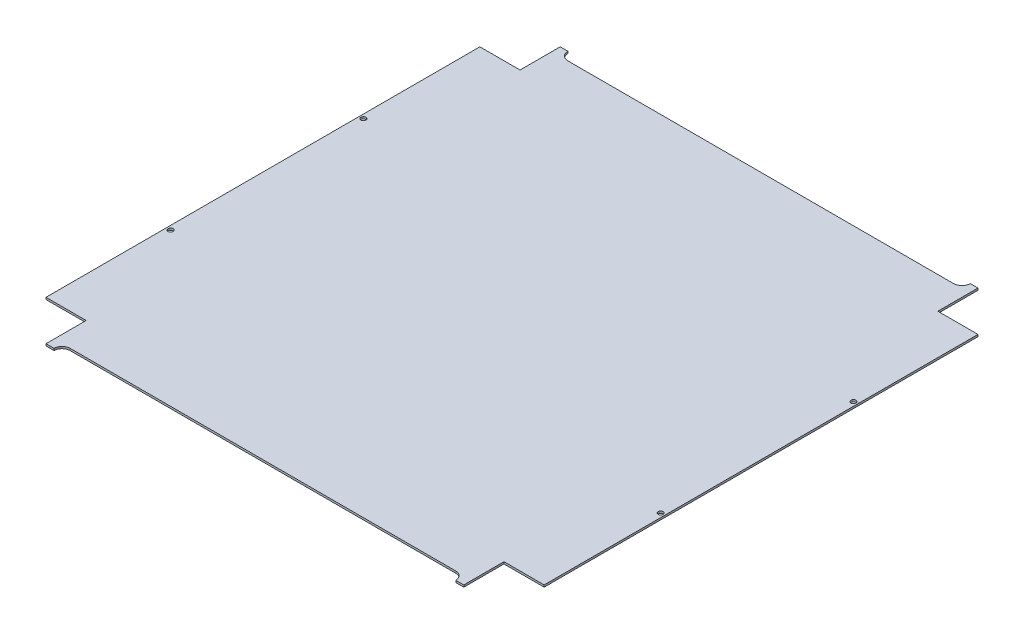
ISO-10303-21;
HEADER;
FILE_DESCRIPTION(('STEP AP214'),'2;1');
FILE_NAME('part.step','',(''),(''),'','','');
FILE_SCHEMA(('AUTOMOTIVE_DESIGN { 1 0 10303 214 1 1 1 1 }'));
ENDSEC;
DATA;
#1=APPLICATION_CONTEXT('core data for automotive mechanical design processes');
#2=APPLICATION_PROTOCOL_DEFINITION('international standard','automotive_design',2000,#1);
#3=PRODUCT_CONTEXT('',#1,'mechanical');
#4=PRODUCT('Part','Part','',(#3));
#5=PRODUCT_RELATED_PRODUCT_CATEGORY('part','',(#4));
#6=PRODUCT_DEFINITION_FORMATION('','',#4);
#7=PRODUCT_DEFINITION_CONTEXT('part definition',#1,'design');
#8=PRODUCT_DEFINITION('design','',#6,#7);
#9=PRODUCT_DEFINITION_SHAPE('','',#8);
#10=(LENGTH_UNIT() NAMED_UNIT(*) SI_UNIT(.MILLI.,.METRE.));
#11=(NAMED_UNIT(*) PLANE_ANGLE_UNIT() SI_UNIT($,.RADIAN.));
#12=(NAMED_UNIT(*) SI_UNIT($,.STERADIAN.) SOLID_ANGLE_UNIT());
#13=UNCERTAINTY_MEASURE_WITH_UNIT(LENGTH_MEASURE(1.E-05),#10,'distance_accuracy_value','');
#14=(GEOMETRIC_REPRESENTATION_CONTEXT(3) GLOBAL_UNCERTAINTY_ASSIGNED_CONTEXT((#13)) GLOBAL_UNIT_ASSIGNED_CONTEXT((#10,
#11,#12)) REPRESENTATION_CONTEXT('',''));
#15=CARTESIAN_POINT('',(0.,0.,0.));
#16=DIRECTION('',(0.,0.,1.));
#17=DIRECTION('',(1.,0.,0.));
#18=AXIS2_PLACEMENT_3D('',#15,#16,#17);
#19=CARTESIAN_POINT('',(150.65127350678,1.5875,-205.005137025259));
#20=DIRECTION('',(0.,-1.,0.));
#21=DIRECTION('',(0.,0.,-1.));
#22=AXIS2_PLACEMENT_3D('',#19,#20,#21);
#23=CYLINDRICAL_SURFACE('',#22,6.60722606806879);
#24=CARTESIAN_POINT('',(150.65127350678,0.,-205.005137025259));
#25=DIRECTION('',(0.,1.,0.));
#26=DIRECTION('',(0.,0.,1.));
#27=AXIS2_PLACEMENT_3D('',#24,#25,#26);
#28=CIRCLE('',#27,6.60722606806879);
#29=CARTESIAN_POINT('',(150.65127350678,0.,-198.39791095719));
#30=VERTEX_POINT('',#29);
#31=CARTESIAN_POINT('',(157.258499574849,0.,-205.005137025259));
#32=VERTEX_POINT('',#31);
#33=EDGE_CURVE('E205',#30,#32,#28,.T.);
#34=ORIENTED_EDGE('',*,*,#33,.F.);
#35=DIRECTION('',(0.,-1.,0.));
#36=VECTOR('',#35,1.);
#37=CARTESIAN_POINT('',(150.65127350678,1.5875,-198.39791095719));
#38=LINE('',#37,#36);
#39=CARTESIAN_POINT('',(150.65127350678,1.5875,-198.39791095719));
#40=VERTEX_POINT('',#39);
#41=EDGE_CURVE('E11',#40,#30,#38,.T.);
#42=ORIENTED_EDGE('',*,*,#41,.F.);
#43=CARTESIAN_POINT('',(150.65127350678,1.5875,-205.005137025259));
#44=DIRECTION('',(0.,1.,0.));
#45=DIRECTION('',(0.,0.,1.));
#46=AXIS2_PLACEMENT_3D('',#43,#44,#45);
#47=CIRCLE('',#46,6.60722606806879);
#48=CARTESIAN_POINT('',(157.258499574849,1.5875,-205.005137025259));
#49=VERTEX_POINT('',#48);
#50=EDGE_CURVE('E312',#40,#49,#47,.T.);
#51=ORIENTED_EDGE('',*,*,#50,.T.);
#52=DIRECTION('',(0.,-1.,0.));
#53=VECTOR('',#52,1.);
#54=CARTESIAN_POINT('',(157.258499574849,1.5875,-205.005137025259));
#55=LINE('',#54,#53);
#56=EDGE_CURVE('E55',#49,#32,#55,.T.);
#57=ORIENTED_EDGE('',*,*,#56,.T.);
#58=EDGE_LOOP('',(#34,#42,#51,#57));
#59=FACE_BOUND('',#58,.T.);
#60=ADVANCED_FACE('F39',(#59),#23,.F.);
#61=CARTESIAN_POINT('',(0.,1.5875,-198.39791095719));
#62=DIRECTION('',(0.,0.,-1.));
#63=DIRECTION('',(-1.,0.,0.));
#64=AXIS2_PLACEMENT_3D('',#61,#62,#63);
#65=PLANE('',#64);
#66=DIRECTION('',(1.,0.,0.));
#67=VECTOR('',#66,1.);
#68=CARTESIAN_POINT('',(0.,0.,-198.39791095719));
#69=LINE('',#68,#67);
#70=CARTESIAN_POINT('',(-154.14872649322,0.,-198.39791095719));
#71=VERTEX_POINT('',#70);
#72=EDGE_CURVE('E207',#71,#30,#69,.T.);
#73=ORIENTED_EDGE('',*,*,#72,.F.);
#74=DIRECTION('',(0.,-1.,0.));
#75=VECTOR('',#74,1.);
#76=CARTESIAN_POINT('',(-154.14872649322,1.5875,-198.39791095719));
#77=LINE('',#76,#75);
#78=CARTESIAN_POINT('',(-154.14872649322,1.5875,-198.39791095719));
#79=VERTEX_POINT('',#78);
#80=EDGE_CURVE('E47',#79,#71,#77,.T.);
#81=ORIENTED_EDGE('',*,*,#80,.F.);
#82=DIRECTION('',(1.,0.,0.));
#83=VECTOR('',#82,1.);
#84=CARTESIAN_POINT('',(0.,1.5875,-198.39791095719));
#85=LINE('',#84,#83);
#86=EDGE_CURVE('E309',#79,#40,#85,.T.);
#87=ORIENTED_EDGE('',*,*,#86,.T.);
#88=ORIENTED_EDGE('',*,*,#41,.T.);
#89=EDGE_LOOP('',(#73,#81,#87,#88));
#90=FACE_BOUND('',#89,.T.);
#91=ADVANCED_FACE('F299',(#90),#65,.T.);
#92=CARTESIAN_POINT('',(-154.14872649322,1.5875,-205.005137025259));
#93=DIRECTION('',(0.,-1.,0.));
#94=DIRECTION('',(0.,0.,-1.));
#95=AXIS2_PLACEMENT_3D('',#92,#93,#94);
#96=CYLINDRICAL_SURFACE('',#95,6.60722606806879);
#97=CARTESIAN_POINT('',(-154.14872649322,0.,-205.005137025259));
#98=DIRECTION('',(0.,1.,0.));
#99=DIRECTION('',(0.,0.,1.));
#100=AXIS2_PLACEMENT_3D('',#97,#98,#99);
#101=CIRCLE('',#100,6.60722606806879);
#102=CARTESIAN_POINT('',(-160.755952561289,0.,-205.005137025259));
#103=VERTEX_POINT('',#102);
#104=EDGE_CURVE('E211',#103,#71,#101,.T.);
#105=ORIENTED_EDGE('',*,*,#104,.F.);
#106=DIRECTION('',(0.,-1.,0.));
#107=VECTOR('',#106,1.);
#108=CARTESIAN_POINT('',(-160.755952561289,1.5875,-205.005137025259));
#109=LINE('',#108,#107);
#110=CARTESIAN_POINT('',(-160.755952561289,1.5875,-205.005137025259));
#111=VERTEX_POINT('',#110);
#112=EDGE_CURVE('E288',#111,#103,#109,.T.);
#113=ORIENTED_EDGE('',*,*,#112,.F.);
#114=CARTESIAN_POINT('',(-154.14872649322,1.5875,-205.005137025259));
#115=DIRECTION('',(0.,1.,0.));
#116=DIRECTION('',(0.,0.,1.));
#117=AXIS2_PLACEMENT_3D('',#114,#115,#116);
#118=CIRCLE('',#117,6.60722606806879);
#119=EDGE_CURVE('E295',#111,#79,#118,.T.);
#120=ORIENTED_EDGE('',*,*,#119,.T.);
#121=ORIENTED_EDGE('',*,*,#80,.T.);
#122=EDGE_LOOP('',(#105,#113,#120,#121));
#123=FACE_BOUND('',#122,.T.);
#124=ADVANCED_FACE('F293',(#123),#96,.F.);
#125=CARTESIAN_POINT('',(0.,1.5875,-205.005137025259));
#126=DIRECTION('',(0.,0.,-1.));
#127=DIRECTION('',(-1.,0.,0.));
#128=AXIS2_PLACEMENT_3D('',#125,#126,#127);
#129=PLANE('',#128);
#130=DIRECTION('',(1.,0.,0.));
#131=VECTOR('',#130,1.);
#132=CARTESIAN_POINT('',(0.,0.,-205.005137025259));
#133=LINE('',#132,#131);
#134=CARTESIAN_POINT('',(-166.84872649322,0.,-205.005137025259));
#135=VERTEX_POINT('',#134);
#136=EDGE_CURVE('E214',#135,#103,#133,.T.);
#137=ORIENTED_EDGE('',*,*,#136,.F.);
#138=DIRECTION('',(0.,-1.,0.));
#139=VECTOR('',#138,1.);
#140=CARTESIAN_POINT('',(-166.84872649322,1.5875,-205.005137025259));
#141=LINE('',#140,#139);
#142=CARTESIAN_POINT('',(-166.84872649322,1.5875,-205.005137025259));
#143=VERTEX_POINT('',#142);
#144=EDGE_CURVE('E286',#143,#135,#141,.T.);
#145=ORIENTED_EDGE('',*,*,#144,.F.);
#146=DIRECTION('',(1.,0.,0.));
#147=VECTOR('',#146,1.);
#148=CARTESIAN_POINT('',(0.,1.5875,-205.005137025259));
#149=LINE('',#148,#147);
#150=EDGE_CURVE('E202',#143,#111,#149,.T.);
#151=ORIENTED_EDGE('',*,*,#150,.T.);
#152=ORIENTED_EDGE('',*,*,#112,.T.);
#153=EDGE_LOOP('',(#137,#145,#151,#152));
#154=FACE_BOUND('',#153,.T.);
#155=ADVANCED_FACE('F305',(#154),#129,.T.);
#156=CARTESIAN_POINT('',(-166.84872649322,1.5875,-2.91715429578202E-13));
#157=DIRECTION('',(1.,0.,0.));
#158=DIRECTION('',(0.,0.,-1.));
#159=AXIS2_PLACEMENT_3D('',#156,#157,#158);
#160=PLANE('',#159);
#161=DIRECTION('',(0.,0.,1.));
#162=VECTOR('',#161,1.);
#163=CARTESIAN_POINT('',(-166.84872649322,0.,-2.91715429578202E-13));
#164=LINE('',#163,#162);
#165=CARTESIAN_POINT('',(-166.84872649322,0.,-173.255137025259));
#166=VERTEX_POINT('',#165);
#167=EDGE_CURVE('E217',#135,#166,#164,.T.);
#168=ORIENTED_EDGE('',*,*,#167,.T.);
#169=DIRECTION('',(0.,-1.,0.));
#170=VECTOR('',#169,1.);
#171=CARTESIAN_POINT('',(-166.84872649322,1.5875,-173.255137025259));
#172=LINE('',#171,#170);
#173=CARTESIAN_POINT('',(-166.84872649322,1.5875,-173.255137025259));
#174=VERTEX_POINT('',#173);
#175=EDGE_CURVE('E284',#174,#166,#172,.T.);
#176=ORIENTED_EDGE('',*,*,#175,.F.);
#177=DIRECTION('',(0.,0.,1.));
#178=VECTOR('',#177,1.);
#179=CARTESIAN_POINT('',(-166.84872649322,1.5875,-2.91715429578202E-13));
#180=LINE('',#179,#178);
#181=EDGE_CURVE('E311',#143,#174,#180,.T.);
#182=ORIENTED_EDGE('',*,*,#181,.F.);
#183=ORIENTED_EDGE('',*,*,#144,.T.);
#184=EDGE_LOOP('',(#168,#176,#182,#183));
#185=FACE_BOUND('',#184,.T.);
#186=ADVANCED_FACE('F408',(#185),#160,.F.);
#187=CARTESIAN_POINT('',(0.,1.5875,-173.255137025259));
#188=DIRECTION('',(0.,0.,-1.));
#189=DIRECTION('',(-1.,0.,0.));
#190=AXIS2_PLACEMENT_3D('',#187,#188,#189);
#191=PLANE('',#190);
#192=DIRECTION('',(1.,0.,0.));
#193=VECTOR('',#192,1.);
#194=CARTESIAN_POINT('',(0.,0.,-173.255137025259));
#195=LINE('',#194,#193);
#196=CARTESIAN_POINT('',(-198.59872649322,0.,-173.255137025259));
#197=VERTEX_POINT('',#196);
#198=EDGE_CURVE('E221',#197,#166,#195,.T.);
#199=ORIENTED_EDGE('',*,*,#198,.F.);
#200=DIRECTION('',(0.,-1.,0.));
#201=VECTOR('',#200,1.);
#202=CARTESIAN_POINT('',(-198.59872649322,1.5875,-173.255137025259));
#203=LINE('',#202,#201);
#204=CARTESIAN_POINT('',(-198.59872649322,1.5875,-173.255137025259));
#205=VERTEX_POINT('',#204);
#206=EDGE_CURVE('E282',#205,#197,#203,.T.);
#207=ORIENTED_EDGE('',*,*,#206,.F.);
#208=DIRECTION('',(1.,0.,0.));
#209=VECTOR('',#208,1.);
#210=CARTESIAN_POINT('',(0.,1.5875,-173.255137025259));
#211=LINE('',#210,#209);
#212=EDGE_CURVE('E317',#205,#174,#211,.T.);
#213=ORIENTED_EDGE('',*,*,#212,.T.);
#214=ORIENTED_EDGE('',*,*,#175,.T.);
#215=EDGE_LOOP('',(#199,#207,#213,#214));
#216=FACE_BOUND('',#215,.T.);
#217=ADVANCED_FACE('F411',(#216),#191,.T.);
#218=CARTESIAN_POINT('',(-198.59872649322,1.5875,0.));
#219=DIRECTION('',(1.,0.,0.));
#220=DIRECTION('',(0.,0.,-1.));
#221=AXIS2_PLACEMENT_3D('',#218,#219,#220);
#222=PLANE('',#221);
#223=DIRECTION('',(0.,0.,1.));
#224=VECTOR('',#223,1.);
#225=CARTESIAN_POINT('',(-198.59872649322,0.,0.));
#226=LINE('',#225,#224);
#227=CARTESIAN_POINT('',(-198.59872649322,0.,169.644862974739));
#228=VERTEX_POINT('',#227);
#229=EDGE_CURVE('E224',#197,#228,#226,.T.);
#230=ORIENTED_EDGE('',*,*,#229,.T.);
#231=DIRECTION('',(0.,-1.,0.));
#232=VECTOR('',#231,1.);
#233=CARTESIAN_POINT('',(-198.59872649322,1.5875,169.644862974739));
#234=LINE('',#233,#232);
#235=CARTESIAN_POINT('',(-198.59872649322,1.5875,169.644862974739));
#236=VERTEX_POINT('',#235);
#237=EDGE_CURVE('E279',#236,#228,#234,.T.);
#238=ORIENTED_EDGE('',*,*,#237,.F.);
#239=DIRECTION('',(0.,0.,1.));
#240=VECTOR('',#239,1.);
#241=CARTESIAN_POINT('',(-198.59872649322,1.5875,0.));
#242=LINE('',#241,#240);
#243=EDGE_CURVE('E320',#205,#236,#242,.T.);
#244=ORIENTED_EDGE('',*,*,#243,.F.);
#245=ORIENTED_EDGE('',*,*,#206,.T.);
#246=EDGE_LOOP('',(#230,#238,#244,#245));
#247=FACE_BOUND('',#246,.T.);
#248=ADVANCED_FACE('F415',(#247),#222,.F.);
#249=CARTESIAN_POINT('',(1.48302073136957E-13,1.5875,169.644862974739));
#250=DIRECTION('',(0.,0.,-1.));
#251=DIRECTION('',(-1.,0.,0.));
#252=AXIS2_PLACEMENT_3D('',#249,#250,#251);
#253=PLANE('',#252);
#254=DIRECTION('',(1.,0.,0.));
#255=VECTOR('',#254,1.);
#256=CARTESIAN_POINT('',(1.48302073136957E-13,0.,169.644862974739));
#257=LINE('',#256,#255);
#258=CARTESIAN_POINT('',(-166.84872649322,0.,169.644862974739));
#259=VERTEX_POINT('',#258);
#260=EDGE_CURVE('E226',#228,#259,#257,.T.);
#261=ORIENTED_EDGE('',*,*,#260,.T.);
#262=DIRECTION('',(0.,-1.,0.));
#263=VECTOR('',#262,1.);
#264=CARTESIAN_POINT('',(-166.84872649322,1.5875,169.644862974739));
#265=LINE('',#264,#263);
#266=CARTESIAN_POINT('',(-166.84872649322,1.5875,169.644862974739));
#267=VERTEX_POINT('',#266);
#268=EDGE_CURVE('E277',#267,#259,#265,.T.);
#269=ORIENTED_EDGE('',*,*,#268,.F.);
#270=DIRECTION('',(1.,0.,0.));
#271=VECTOR('',#270,1.);
#272=CARTESIAN_POINT('',(1.48302073136957E-13,1.5875,169.644862974739));
#273=LINE('',#272,#271);
#274=EDGE_CURVE('E322',#236,#267,#273,.T.);
#275=ORIENTED_EDGE('',*,*,#274,.F.);
#276=ORIENTED_EDGE('',*,*,#237,.T.);
#277=EDGE_LOOP('',(#261,#269,#275,#276));
#278=FACE_BOUND('',#277,.T.);
#279=ADVANCED_FACE('F419',(#278),#253,.F.);
#280=CARTESIAN_POINT('',(-166.84872649322,1.5875,-1.458577147891E-13));
#281=DIRECTION('',(-1.,0.,0.));
#282=DIRECTION('',(0.,0.,1.));
#283=AXIS2_PLACEMENT_3D('',#280,#281,#282);
#284=PLANE('',#283);
#285=DIRECTION('',(0.,0.,-1.));
#286=VECTOR('',#285,1.);
#287=CARTESIAN_POINT('',(-166.84872649322,0.,-1.458577147891E-13));
#288=LINE('',#287,#286);
#289=CARTESIAN_POINT('',(-166.84872649322,0.,201.394862974741));
#290=VERTEX_POINT('',#289);
#291=EDGE_CURVE('E229',#290,#259,#288,.T.);
#292=ORIENTED_EDGE('',*,*,#291,.F.);
#293=DIRECTION('',(0.,-1.,0.));
#294=VECTOR('',#293,1.);
#295=CARTESIAN_POINT('',(-166.84872649322,1.5875,201.394862974741));
#296=LINE('',#295,#294);
#297=CARTESIAN_POINT('',(-166.84872649322,1.5875,201.394862974741));
#298=VERTEX_POINT('',#297);
#299=EDGE_CURVE('E275',#298,#290,#296,.T.);
#300=ORIENTED_EDGE('',*,*,#299,.F.);
#301=DIRECTION('',(0.,0.,-1.));
#302=VECTOR('',#301,1.);
#303=CARTESIAN_POINT('',(-166.84872649322,1.5875,-1.458577147891E-13));
#304=LINE('',#303,#302);
#305=EDGE_CURVE('E324',#298,#267,#304,.T.);
#306=ORIENTED_EDGE('',*,*,#305,.T.);
#307=ORIENTED_EDGE('',*,*,#268,.T.);
#308=EDGE_LOOP('',(#292,#300,#306,#307));
#309=FACE_BOUND('',#308,.T.);
#310=ADVANCED_FACE('F423',(#309),#284,.T.);
#311=CARTESIAN_POINT('',(0.,1.5875,201.394862974741));
#312=DIRECTION('',(0.,0.,-1.));
#313=DIRECTION('',(-1.,0.,0.));
#314=AXIS2_PLACEMENT_3D('',#311,#312,#313);
#315=PLANE('',#314);
#316=DIRECTION('',(1.,0.,0.));
#317=VECTOR('',#316,1.);
#318=CARTESIAN_POINT('',(0.,0.,201.394862974741));
#319=LINE('',#318,#317);
#320=CARTESIAN_POINT('',(-160.49872649322,0.,201.394862974741));
#321=VERTEX_POINT('',#320);
#322=EDGE_CURVE('E232',#290,#321,#319,.T.);
#323=ORIENTED_EDGE('',*,*,#322,.T.);
#324=DIRECTION('',(0.,-1.,0.));
#325=VECTOR('',#324,1.);
#326=CARTESIAN_POINT('',(-160.49872649322,1.5875,201.394862974741));
#327=LINE('',#326,#325);
#328=CARTESIAN_POINT('',(-160.49872649322,1.5875,201.394862974741));
#329=VERTEX_POINT('',#328);
#330=EDGE_CURVE('E273',#329,#321,#327,.T.);
#331=ORIENTED_EDGE('',*,*,#330,.F.);
#332=DIRECTION('',(1.,0.,0.));
#333=VECTOR('',#332,1.);
#334=CARTESIAN_POINT('',(0.,1.5875,201.394862974741));
#335=LINE('',#334,#333);
#336=EDGE_CURVE('E327',#298,#329,#335,.T.);
#337=ORIENTED_EDGE('',*,*,#336,.F.);
#338=ORIENTED_EDGE('',*,*,#299,.T.);
#339=EDGE_LOOP('',(#323,#331,#337,#338));
#340=FACE_BOUND('',#339,.T.);
#341=ADVANCED_FACE('F427',(#340),#315,.F.);
#342=CARTESIAN_POINT('',(-154.14872649322,1.5875,201.394862974739));
#343=DIRECTION('',(0.,-1.,0.));
#344=DIRECTION('',(0.,0.,-1.));
#345=AXIS2_PLACEMENT_3D('',#342,#343,#344);
#346=CYLINDRICAL_SURFACE('',#345,6.34999999999994);
#347=CARTESIAN_POINT('',(-154.14872649322,0.,201.394862974739));
#348=DIRECTION('',(0.,1.,0.));
#349=DIRECTION('',(0.,0.,1.));
#350=AXIS2_PLACEMENT_3D('',#347,#348,#349);
#351=CIRCLE('',#350,6.34999999999994);
#352=CARTESIAN_POINT('',(-154.14872649322,0.,195.044862974739));
#353=VERTEX_POINT('',#352);
#354=EDGE_CURVE('E235',#353,#321,#351,.T.);
#355=ORIENTED_EDGE('',*,*,#354,.F.);
#356=DIRECTION('',(0.,-1.,0.));
#357=VECTOR('',#356,1.);
#358=CARTESIAN_POINT('',(-154.14872649322,1.5875,195.044862974739));
#359=LINE('',#358,#357);
#360=CARTESIAN_POINT('',(-154.14872649322,1.5875,195.044862974739));
#361=VERTEX_POINT('',#360);
#362=EDGE_CURVE('E271',#361,#353,#359,.T.);
#363=ORIENTED_EDGE('',*,*,#362,.F.);
#364=CARTESIAN_POINT('',(-154.14872649322,1.5875,201.394862974739));
#365=DIRECTION('',(0.,1.,0.));
#366=DIRECTION('',(0.,0.,1.));
#367=AXIS2_PLACEMENT_3D('',#364,#365,#366);
#368=CIRCLE('',#367,6.34999999999994);
#369=EDGE_CURVE('E329',#361,#329,#368,.T.);
#370=ORIENTED_EDGE('',*,*,#369,.T.);
#371=ORIENTED_EDGE('',*,*,#330,.T.);
#372=EDGE_LOOP('',(#355,#363,#370,#371));
#373=FACE_BOUND('',#372,.T.);
#374=ADVANCED_FACE('F429',(#373),#346,.F.);
#375=CARTESIAN_POINT('',(0.,1.5875,195.044862974739));
#376=DIRECTION('',(0.,0.,-1.));
#377=DIRECTION('',(-1.,0.,0.));
#378=AXIS2_PLACEMENT_3D('',#375,#376,#377);
#379=PLANE('',#378);
#380=DIRECTION('',(1.,0.,0.));
#381=VECTOR('',#380,1.);
#382=CARTESIAN_POINT('',(0.,0.,195.044862974739));
#383=LINE('',#382,#381);
#384=CARTESIAN_POINT('',(150.65127350678,0.,195.044862974739));
#385=VERTEX_POINT('',#384);
#386=EDGE_CURVE('E239',#353,#385,#383,.T.);
#387=ORIENTED_EDGE('',*,*,#386,.T.);
#388=DIRECTION('',(0.,-1.,0.));
#389=VECTOR('',#388,1.);
#390=CARTESIAN_POINT('',(150.65127350678,1.5875,195.044862974739));
#391=LINE('',#390,#389);
#392=CARTESIAN_POINT('',(150.65127350678,1.5875,195.044862974739));
#393=VERTEX_POINT('',#392);
#394=EDGE_CURVE('E269',#393,#385,#391,.T.);
#395=ORIENTED_EDGE('',*,*,#394,.F.);
#396=DIRECTION('',(1.,0.,0.));
#397=VECTOR('',#396,1.);
#398=CARTESIAN_POINT('',(0.,1.5875,195.044862974739));
#399=LINE('',#398,#397);
#400=EDGE_CURVE('E333',#361,#393,#399,.T.);
#401=ORIENTED_EDGE('',*,*,#400,.F.);
#402=ORIENTED_EDGE('',*,*,#362,.T.);
#403=EDGE_LOOP('',(#387,#395,#401,#402));
#404=FACE_BOUND('',#403,.T.);
#405=ADVANCED_FACE('F432',(#404),#379,.F.);
#406=CARTESIAN_POINT('',(150.65127350678,1.5875,201.394862974739));
#407=DIRECTION('',(0.,-1.,0.));
#408=DIRECTION('',(0.,0.,-1.));
#409=AXIS2_PLACEMENT_3D('',#406,#407,#408);
#410=CYLINDRICAL_SURFACE('',#409,6.34999999999994);
#411=CARTESIAN_POINT('',(150.65127350678,0.,201.394862974739));
#412=DIRECTION('',(0.,1.,0.));
#413=DIRECTION('',(0.,0.,1.));
#414=AXIS2_PLACEMENT_3D('',#411,#412,#413);
#415=CIRCLE('',#414,6.34999999999994);
#416=CARTESIAN_POINT('',(157.00127350678,0.,201.394862974741));
#417=VERTEX_POINT('',#416);
#418=EDGE_CURVE('E242',#417,#385,#415,.T.);
#419=ORIENTED_EDGE('',*,*,#418,.F.);
#420=DIRECTION('',(0.,-1.,0.));
#421=VECTOR('',#420,1.);
#422=CARTESIAN_POINT('',(157.00127350678,1.5875,201.394862974741));
#423=LINE('',#422,#421);
#424=CARTESIAN_POINT('',(157.00127350678,1.5875,201.394862974741));
#425=VERTEX_POINT('',#424);
#426=EDGE_CURVE('E267',#425,#417,#423,.T.);
#427=ORIENTED_EDGE('',*,*,#426,.F.);
#428=CARTESIAN_POINT('',(150.65127350678,1.5875,201.394862974739));
#429=DIRECTION('',(0.,1.,0.));
#430=DIRECTION('',(0.,0.,1.));
#431=AXIS2_PLACEMENT_3D('',#428,#429,#430);
#432=CIRCLE('',#431,6.34999999999994);
#433=EDGE_CURVE('E335',#425,#393,#432,.T.);
#434=ORIENTED_EDGE('',*,*,#433,.T.);
#435=ORIENTED_EDGE('',*,*,#394,.T.);
#436=EDGE_LOOP('',(#419,#427,#434,#435));
#437=FACE_BOUND('',#436,.T.);
#438=ADVANCED_FACE('F436',(#437),#410,.F.);
#439=CARTESIAN_POINT('',(163.35127350678,0.,201.394862974741));
#440=VERTEX_POINT('',#439);
#441=EDGE_CURVE('E236',#417,#440,#319,.T.);
#442=ORIENTED_EDGE('',*,*,#441,.T.);
#443=DIRECTION('',(0.,-1.,0.));
#444=VECTOR('',#443,1.);
#445=CARTESIAN_POINT('',(163.35127350678,1.5875,201.394862974741));
#446=LINE('',#445,#444);
#447=CARTESIAN_POINT('',(163.35127350678,1.5875,201.394862974741));
#448=VERTEX_POINT('',#447);
#449=EDGE_CURVE('E264',#448,#440,#446,.T.);
#450=ORIENTED_EDGE('',*,*,#449,.F.);
#451=EDGE_CURVE('E330',#425,#448,#335,.T.);
#452=ORIENTED_EDGE('',*,*,#451,.F.);
#453=ORIENTED_EDGE('',*,*,#426,.T.);
#454=EDGE_LOOP('',(#442,#450,#452,#453));
#455=FACE_BOUND('',#454,.T.);
#456=ADVANCED_FACE('F440',(#455),#315,.F.);
#457=CARTESIAN_POINT('',(163.35127350678,1.5875,0.));
#458=DIRECTION('',(-1.,0.,0.));
#459=DIRECTION('',(0.,0.,1.));
#460=AXIS2_PLACEMENT_3D('',#457,#458,#459);
#461=PLANE('',#460);
#462=DIRECTION('',(0.,0.,-1.));
#463=VECTOR('',#462,1.);
#464=CARTESIAN_POINT('',(163.35127350678,0.,0.));
#465=LINE('',#464,#463);
#466=CARTESIAN_POINT('',(163.35127350678,0.,169.644862974739));
#467=VERTEX_POINT('',#466);
#468=EDGE_CURVE('E245',#440,#467,#465,.T.);
#469=ORIENTED_EDGE('',*,*,#468,.T.);
#470=DIRECTION('',(0.,-1.,0.));
#471=VECTOR('',#470,1.);
#472=CARTESIAN_POINT('',(163.35127350678,1.5875,169.644862974739));
#473=LINE('',#472,#471);
#474=CARTESIAN_POINT('',(163.35127350678,1.5875,169.644862974739));
#475=VERTEX_POINT('',#474);
#476=EDGE_CURVE('E262',#475,#467,#473,.T.);
#477=ORIENTED_EDGE('',*,*,#476,.F.);
#478=DIRECTION('',(0.,0.,-1.));
#479=VECTOR('',#478,1.);
#480=CARTESIAN_POINT('',(163.35127350678,1.5875,0.));
#481=LINE('',#480,#479);
#482=EDGE_CURVE('E338',#448,#475,#481,.T.);
#483=ORIENTED_EDGE('',*,*,#482,.F.);
#484=ORIENTED_EDGE('',*,*,#449,.T.);
#485=EDGE_LOOP('',(#469,#477,#483,#484));
#486=FACE_BOUND('',#485,.T.);
#487=ADVANCED_FACE('F444',(#486),#461,.F.);
#488=CARTESIAN_POINT('',(0.,1.5875,169.644862974739));
#489=DIRECTION('',(0.,0.,1.));
#490=DIRECTION('',(1.,0.,0.));
#491=AXIS2_PLACEMENT_3D('',#488,#489,#490);
#492=PLANE('',#491);
#493=DIRECTION('',(-1.,0.,0.));
#494=VECTOR('',#493,1.);
#495=CARTESIAN_POINT('',(0.,0.,169.644862974739));
#496=LINE('',#495,#494);
#497=CARTESIAN_POINT('',(195.10127350678,0.,169.644862974739));
#498=VERTEX_POINT('',#497);
#499=EDGE_CURVE('E248',#498,#467,#496,.T.);
#500=ORIENTED_EDGE('',*,*,#499,.F.);
#501=DIRECTION('',(0.,-1.,0.));
#502=VECTOR('',#501,1.);
#503=CARTESIAN_POINT('',(195.10127350678,1.5875,169.644862974739));
#504=LINE('',#503,#502);
#505=CARTESIAN_POINT('',(195.10127350678,1.5875,169.644862974739));
#506=VERTEX_POINT('',#505);
#507=EDGE_CURVE('E260',#506,#498,#504,.T.);
#508=ORIENTED_EDGE('',*,*,#507,.F.);
#509=DIRECTION('',(-1.,0.,0.));
#510=VECTOR('',#509,1.);
#511=CARTESIAN_POINT('',(0.,1.5875,169.644862974739));
#512=LINE('',#511,#510);
#513=EDGE_CURVE('E340',#506,#475,#512,.T.);
#514=ORIENTED_EDGE('',*,*,#513,.T.);
#515=ORIENTED_EDGE('',*,*,#476,.T.);
#516=EDGE_LOOP('',(#500,#508,#514,#515));
#517=FACE_BOUND('',#516,.T.);
#518=ADVANCED_FACE('F448',(#517),#492,.T.);
#519=CARTESIAN_POINT('',(195.10127350678,1.5875,0.));
#520=DIRECTION('',(1.,0.,0.));
#521=DIRECTION('',(0.,0.,-1.));
#522=AXIS2_PLACEMENT_3D('',#519,#520,#521);
#523=PLANE('',#522);
#524=DIRECTION('',(0.,0.,1.));
#525=VECTOR('',#524,1.);
#526=CARTESIAN_POINT('',(195.10127350678,0.,0.));
#527=LINE('',#526,#525);
#528=CARTESIAN_POINT('',(195.10127350678,0.,-173.255137025259));
#529=VERTEX_POINT('',#528);
#530=EDGE_CURVE('E251',#529,#498,#527,.T.);
#531=ORIENTED_EDGE('',*,*,#530,.F.);
#532=DIRECTION('',(0.,-1.,0.));
#533=VECTOR('',#532,1.);
#534=CARTESIAN_POINT('',(195.10127350678,1.5875,-173.255137025259));
#535=LINE('',#534,#533);
#536=CARTESIAN_POINT('',(195.10127350678,1.5875,-173.255137025259));
#537=VERTEX_POINT('',#536);
#538=EDGE_CURVE('E196',#537,#529,#535,.T.);
#539=ORIENTED_EDGE('',*,*,#538,.F.);
#540=DIRECTION('',(0.,0.,1.));
#541=VECTOR('',#540,1.);
#542=CARTESIAN_POINT('',(195.10127350678,1.5875,0.));
#543=LINE('',#542,#541);
#544=EDGE_CURVE('E186',#537,#506,#543,.T.);
#545=ORIENTED_EDGE('',*,*,#544,.T.);
#546=ORIENTED_EDGE('',*,*,#507,.T.);
#547=EDGE_LOOP('',(#531,#539,#545,#546));
#548=FACE_BOUND('',#547,.T.);
#549=ADVANCED_FACE('F344',(#548),#523,.T.);
#550=CARTESIAN_POINT('',(0.,1.5875,-173.255137025259));
#551=DIRECTION('',(0.,0.,1.));
#552=DIRECTION('',(1.,0.,0.));
#553=AXIS2_PLACEMENT_3D('',#550,#551,#552);
#554=PLANE('',#553);
#555=DIRECTION('',(-1.,0.,0.));
#556=VECTOR('',#555,1.);
#557=CARTESIAN_POINT('',(0.,0.,-173.255137025259));
#558=LINE('',#557,#556);
#559=CARTESIAN_POINT('',(163.35127350678,0.,-173.255137025259));
#560=VERTEX_POINT('',#559);
#561=EDGE_CURVE('E193',#529,#560,#558,.T.);
#562=ORIENTED_EDGE('',*,*,#561,.T.);
#563=DIRECTION('',(0.,-1.,0.));
#564=VECTOR('',#563,1.);
#565=CARTESIAN_POINT('',(163.35127350678,1.5875,-173.255137025259));
#566=LINE('',#565,#564);
#567=CARTESIAN_POINT('',(163.35127350678,1.5875,-173.255137025259));
#568=VERTEX_POINT('',#567);
#569=EDGE_CURVE('E190',#568,#560,#566,.T.);
#570=ORIENTED_EDGE('',*,*,#569,.F.);
#571=DIRECTION('',(-1.,0.,0.));
#572=VECTOR('',#571,1.);
#573=CARTESIAN_POINT('',(0.,1.5875,-173.255137025259));
#574=LINE('',#573,#572);
#575=EDGE_CURVE('E178',#537,#568,#574,.T.);
#576=ORIENTED_EDGE('',*,*,#575,.F.);
#577=ORIENTED_EDGE('',*,*,#538,.T.);
#578=EDGE_LOOP('',(#562,#570,#576,#577));
#579=FACE_BOUND('',#578,.T.);
#580=ADVANCED_FACE('F191',(#579),#554,.F.);
#581=CARTESIAN_POINT('',(163.35127350678,1.5875,0.));
#582=DIRECTION('',(1.,0.,0.));
#583=DIRECTION('',(0.,0.,-1.));
#584=AXIS2_PLACEMENT_3D('',#581,#582,#583);
#585=PLANE('',#584);
#586=DIRECTION('',(0.,0.,1.));
#587=VECTOR('',#586,1.);
#588=CARTESIAN_POINT('',(163.35127350678,0.,0.));
#589=LINE('',#588,#587);
#590=CARTESIAN_POINT('',(163.35127350678,0.,-205.005137025259));
#591=VERTEX_POINT('',#590);
#592=EDGE_CURVE('E255',#591,#560,#589,.T.);
#593=ORIENTED_EDGE('',*,*,#592,.F.);
#594=DIRECTION('',(0.,-1.,0.));
#595=VECTOR('',#594,1.);
#596=CARTESIAN_POINT('',(163.35127350678,1.5875,-205.005137025259));
#597=LINE('',#596,#595);
#598=CARTESIAN_POINT('',(163.35127350678,1.5875,-205.005137025259));
#599=VERTEX_POINT('',#598);
#600=EDGE_CURVE('E116',#599,#591,#597,.T.);
#601=ORIENTED_EDGE('',*,*,#600,.F.);
#602=DIRECTION('',(0.,0.,1.));
#603=VECTOR('',#602,1.);
#604=CARTESIAN_POINT('',(163.35127350678,1.5875,0.));
#605=LINE('',#604,#603);
#606=EDGE_CURVE('E183',#599,#568,#605,.T.);
#607=ORIENTED_EDGE('',*,*,#606,.T.);
#608=ORIENTED_EDGE('',*,*,#569,.T.);
#609=EDGE_LOOP('',(#593,#601,#607,#608));
#610=FACE_BOUND('',#609,.T.);
#611=ADVANCED_FACE('F198',(#610),#585,.T.);
#612=EDGE_CURVE('E218',#32,#591,#133,.T.);
#613=ORIENTED_EDGE('',*,*,#612,.F.);
#614=ORIENTED_EDGE('',*,*,#56,.F.);
#615=EDGE_CURVE('E199',#49,#599,#149,.T.);
#616=ORIENTED_EDGE('',*,*,#615,.T.);
#617=ORIENTED_EDGE('',*,*,#600,.T.);
#618=EDGE_LOOP('',(#613,#614,#616,#617));
#619=FACE_BOUND('',#618,.T.);
#620=ADVANCED_FACE('F376',(#619),#129,.T.);
#621=CARTESIAN_POINT('',(0.,1.5875,0.));
#622=DIRECTION('',(0.,1.,0.));
#623=DIRECTION('',(0.,0.,1.));
#624=AXIS2_PLACEMENT_3D('',#621,#622,#623);
#625=PLANE('',#624);
#626=CARTESIAN_POINT('',(-195.42372649322,1.5875,-78.0051370252592));
#627=DIRECTION('',(0.,1.,0.));
#628=DIRECTION('',(0.,0.,1.));
#629=AXIS2_PLACEMENT_3D('',#626,#627,#628);
#630=CIRCLE('',#629,1.98437499999998);
#631=CARTESIAN_POINT('',(-195.42372649322,1.5875,-76.0207620252593));
#632=VERTEX_POINT('',#631);
#633=EDGE_CURVE('E368',#632,#632,#630,.T.);
#634=ORIENTED_EDGE('',*,*,#633,.F.);
#635=EDGE_LOOP('',(#634));
#636=FACE_BOUND('',#635,.T.);
#637=CARTESIAN_POINT('',(-195.423726493221,1.5875,74.3948629747408));
#638=DIRECTION('',(0.,1.,0.));
#639=DIRECTION('',(0.,0.,1.));
#640=AXIS2_PLACEMENT_3D('',#637,#638,#639);
#641=CIRCLE('',#640,1.98437499999998);
#642=CARTESIAN_POINT('',(-195.423726493221,1.5875,76.3792379747407));
#643=VERTEX_POINT('',#642);
#644=EDGE_CURVE('E362',#643,#643,#641,.T.);
#645=ORIENTED_EDGE('',*,*,#644,.F.);
#646=EDGE_LOOP('',(#645));
#647=FACE_BOUND('',#646,.T.);
#648=CARTESIAN_POINT('',(191.92627350678,1.5875,74.3948629747391));
#649=DIRECTION('',(0.,1.,0.));
#650=DIRECTION('',(0.,0.,1.));
#651=AXIS2_PLACEMENT_3D('',#648,#649,#650);
#652=CIRCLE('',#651,1.98437499999998);
#653=CARTESIAN_POINT('',(191.92627350678,1.5875,76.3792379747391));
#654=VERTEX_POINT('',#653);
#655=EDGE_CURVE('E356',#654,#654,#652,.T.);
#656=ORIENTED_EDGE('',*,*,#655,.F.);
#657=EDGE_LOOP('',(#656));
#658=FACE_BOUND('',#657,.T.);
#659=CARTESIAN_POINT('',(191.92627350678,1.5875,-78.0051370252609));
#660=DIRECTION('',(0.,1.,0.));
#661=DIRECTION('',(0.,0.,1.));
#662=AXIS2_PLACEMENT_3D('',#659,#660,#661);
#663=CIRCLE('',#662,1.98437499999998);
#664=CARTESIAN_POINT('',(191.92627350678,1.5875,-76.0207620252609));
#665=VERTEX_POINT('',#664);
#666=EDGE_CURVE('E350',#665,#665,#663,.T.);
#667=ORIENTED_EDGE('',*,*,#666,.F.);
#668=EDGE_LOOP('',(#667));
#669=FACE_BOUND('',#668,.T.);
#670=ORIENTED_EDGE('',*,*,#50,.F.);
#671=ORIENTED_EDGE('',*,*,#86,.F.);
#672=ORIENTED_EDGE('',*,*,#119,.F.);
#673=ORIENTED_EDGE('',*,*,#150,.F.);
#674=ORIENTED_EDGE('',*,*,#181,.T.);
#675=ORIENTED_EDGE('',*,*,#212,.F.);
#676=ORIENTED_EDGE('',*,*,#243,.T.);
#677=ORIENTED_EDGE('',*,*,#274,.T.);
#678=ORIENTED_EDGE('',*,*,#305,.F.);
#679=ORIENTED_EDGE('',*,*,#336,.T.);
#680=ORIENTED_EDGE('',*,*,#369,.F.);
#681=ORIENTED_EDGE('',*,*,#400,.T.);
#682=ORIENTED_EDGE('',*,*,#433,.F.);
#683=ORIENTED_EDGE('',*,*,#451,.T.);
#684=ORIENTED_EDGE('',*,*,#482,.T.);
#685=ORIENTED_EDGE('',*,*,#513,.F.);
#686=ORIENTED_EDGE('',*,*,#544,.F.);
#687=ORIENTED_EDGE('',*,*,#575,.T.);
#688=ORIENTED_EDGE('',*,*,#606,.F.);
#689=ORIENTED_EDGE('',*,*,#615,.F.);
#690=EDGE_LOOP('',(#670,#671,#672,#673,#674,#675,#676,#677,#678,#679,#680,#681,#682,#683,#684,
#685,#686,#687,#688,#689));
#691=FACE_BOUND('',#690,.T.);
#692=ADVANCED_FACE('F180',(#636,#647,#658,#669,#691),#625,.T.);
#693=CARTESIAN_POINT('',(0.,0.,0.));
#694=DIRECTION('',(0.,1.,0.));
#695=DIRECTION('',(0.,0.,1.));
#696=AXIS2_PLACEMENT_3D('',#693,#694,#695);
#697=PLANE('',#696);
#698=CARTESIAN_POINT('',(-195.42372649322,0.,-78.0051370252592));
#699=DIRECTION('',(0.,1.,0.));
#700=DIRECTION('',(0.,0.,1.));
#701=AXIS2_PLACEMENT_3D('',#698,#699,#700);
#702=CIRCLE('',#701,1.98437500000001);
#703=CARTESIAN_POINT('',(-195.42372649322,0.,-76.0207620252592));
#704=VERTEX_POINT('',#703);
#705=EDGE_CURVE('E365',#704,#704,#702,.T.);
#706=ORIENTED_EDGE('',*,*,#705,.T.);
#707=EDGE_LOOP('',(#706));
#708=FACE_BOUND('',#707,.T.);
#709=CARTESIAN_POINT('',(-195.423726493221,0.,74.3948629747408));
#710=DIRECTION('',(0.,1.,0.));
#711=DIRECTION('',(0.,0.,1.));
#712=AXIS2_PLACEMENT_3D('',#709,#710,#711);
#713=CIRCLE('',#712,1.98437500000001);
#714=CARTESIAN_POINT('',(-195.423726493221,0.,76.3792379747408));
#715=VERTEX_POINT('',#714);
#716=EDGE_CURVE('E359',#715,#715,#713,.T.);
#717=ORIENTED_EDGE('',*,*,#716,.T.);
#718=EDGE_LOOP('',(#717));
#719=FACE_BOUND('',#718,.T.);
#720=CARTESIAN_POINT('',(191.92627350678,0.,74.3948629747391));
#721=DIRECTION('',(0.,1.,0.));
#722=DIRECTION('',(0.,0.,1.));
#723=AXIS2_PLACEMENT_3D('',#720,#721,#722);
#724=CIRCLE('',#723,1.98437500000001);
#725=CARTESIAN_POINT('',(191.92627350678,0.,76.3792379747391));
#726=VERTEX_POINT('',#725);
#727=EDGE_CURVE('E353',#726,#726,#724,.T.);
#728=ORIENTED_EDGE('',*,*,#727,.T.);
#729=EDGE_LOOP('',(#728));
#730=FACE_BOUND('',#729,.T.);
#731=CARTESIAN_POINT('',(191.92627350678,0.,-78.0051370252609));
#732=DIRECTION('',(0.,1.,0.));
#733=DIRECTION('',(0.,0.,1.));
#734=AXIS2_PLACEMENT_3D('',#731,#732,#733);
#735=CIRCLE('',#734,1.98437500000001);
#736=CARTESIAN_POINT('',(191.92627350678,0.,-76.0207620252608));
#737=VERTEX_POINT('',#736);
#738=EDGE_CURVE('E208',#737,#737,#735,.T.);
#739=ORIENTED_EDGE('',*,*,#738,.T.);
#740=EDGE_LOOP('',(#739));
#741=FACE_BOUND('',#740,.T.);
#742=ORIENTED_EDGE('',*,*,#33,.T.);
#743=ORIENTED_EDGE('',*,*,#612,.T.);
#744=ORIENTED_EDGE('',*,*,#592,.T.);
#745=ORIENTED_EDGE('',*,*,#561,.F.);
#746=ORIENTED_EDGE('',*,*,#530,.T.);
#747=ORIENTED_EDGE('',*,*,#499,.T.);
#748=ORIENTED_EDGE('',*,*,#468,.F.);
#749=ORIENTED_EDGE('',*,*,#441,.F.);
#750=ORIENTED_EDGE('',*,*,#418,.T.);
#751=ORIENTED_EDGE('',*,*,#386,.F.);
#752=ORIENTED_EDGE('',*,*,#354,.T.);
#753=ORIENTED_EDGE('',*,*,#322,.F.);
#754=ORIENTED_EDGE('',*,*,#291,.T.);
#755=ORIENTED_EDGE('',*,*,#260,.F.);
#756=ORIENTED_EDGE('',*,*,#229,.F.);
#757=ORIENTED_EDGE('',*,*,#198,.T.);
#758=ORIENTED_EDGE('',*,*,#167,.F.);
#759=ORIENTED_EDGE('',*,*,#136,.T.);
#760=ORIENTED_EDGE('',*,*,#104,.T.);
#761=ORIENTED_EDGE('',*,*,#72,.T.);
#762=EDGE_LOOP('',(#742,#743,#744,#745,#746,#747,#748,#749,#750,#751,#752,#753,#754,#755,#756,
#757,#758,#759,#760,#761));
#763=FACE_BOUND('',#762,.T.);
#764=ADVANCED_FACE('F301',(#708,#719,#730,#741,#763),#697,.F.);
#765=CARTESIAN_POINT('',(191.92627350678,1.5875,-78.0051370252609));
#766=DIRECTION('',(0.,1.,0.));
#767=DIRECTION('',(0.,0.,1.));
#768=AXIS2_PLACEMENT_3D('',#765,#766,#767);
#769=CYLINDRICAL_SURFACE('',#768,1.984375);
#770=ORIENTED_EDGE('',*,*,#738,.F.);
#771=EDGE_LOOP('',(#770));
#772=FACE_BOUND('',#771,.T.);
#773=ORIENTED_EDGE('',*,*,#666,.T.);
#774=EDGE_LOOP('',(#773));
#775=FACE_BOUND('',#774,.T.);
#776=ADVANCED_FACE('F384',(#772,#775),#769,.F.);
#777=CARTESIAN_POINT('',(191.92627350678,1.5875,74.3948629747391));
#778=DIRECTION('',(0.,1.,0.));
#779=DIRECTION('',(0.,0.,1.));
#780=AXIS2_PLACEMENT_3D('',#777,#778,#779);
#781=CYLINDRICAL_SURFACE('',#780,1.984375);
#782=ORIENTED_EDGE('',*,*,#727,.F.);
#783=EDGE_LOOP('',(#782));
#784=FACE_BOUND('',#783,.T.);
#785=ORIENTED_EDGE('',*,*,#655,.T.);
#786=EDGE_LOOP('',(#785));
#787=FACE_BOUND('',#786,.T.);
#788=ADVANCED_FACE('F386',(#784,#787),#781,.F.);
#789=CARTESIAN_POINT('',(-195.423726493221,1.5875,74.3948629747408));
#790=DIRECTION('',(0.,1.,0.));
#791=DIRECTION('',(0.,0.,1.));
#792=AXIS2_PLACEMENT_3D('',#789,#790,#791);
#793=CYLINDRICAL_SURFACE('',#792,1.984375);
#794=ORIENTED_EDGE('',*,*,#716,.F.);
#795=EDGE_LOOP('',(#794));
#796=FACE_BOUND('',#795,.T.);
#797=ORIENTED_EDGE('',*,*,#644,.T.);
#798=EDGE_LOOP('',(#797));
#799=FACE_BOUND('',#798,.T.);
#800=ADVANCED_FACE('F393',(#796,#799),#793,.F.);
#801=CARTESIAN_POINT('',(-195.42372649322,1.5875,-78.0051370252592));
#802=DIRECTION('',(0.,1.,0.));
#803=DIRECTION('',(0.,0.,1.));
#804=AXIS2_PLACEMENT_3D('',#801,#802,#803);
#805=CYLINDRICAL_SURFACE('',#804,1.984375);
#806=ORIENTED_EDGE('',*,*,#705,.F.);
#807=EDGE_LOOP('',(#806));
#808=FACE_BOUND('',#807,.T.);
#809=ORIENTED_EDGE('',*,*,#633,.T.);
#810=EDGE_LOOP('',(#809));
#811=FACE_BOUND('',#810,.T.);
#812=ADVANCED_FACE('F372',(#808,#811),#805,.F.);
#813=CLOSED_SHELL('',(#60,#91,#124,#155,#186,#217,#248,#279,#310,#341,#374,#405,#438,#456,#487,
#518,#549,#580,#611,#620,#692,#764,#776,#788,#800,#812));
#814=MANIFOLD_SOLID_BREP('B2',#813);
#815=ADVANCED_BREP_SHAPE_REPRESENTATION('',(#18,#814),#14);
#816=SHAPE_DEFINITION_REPRESENTATION(#9,#815);
ENDSEC;
END-ISO-10303-21;
